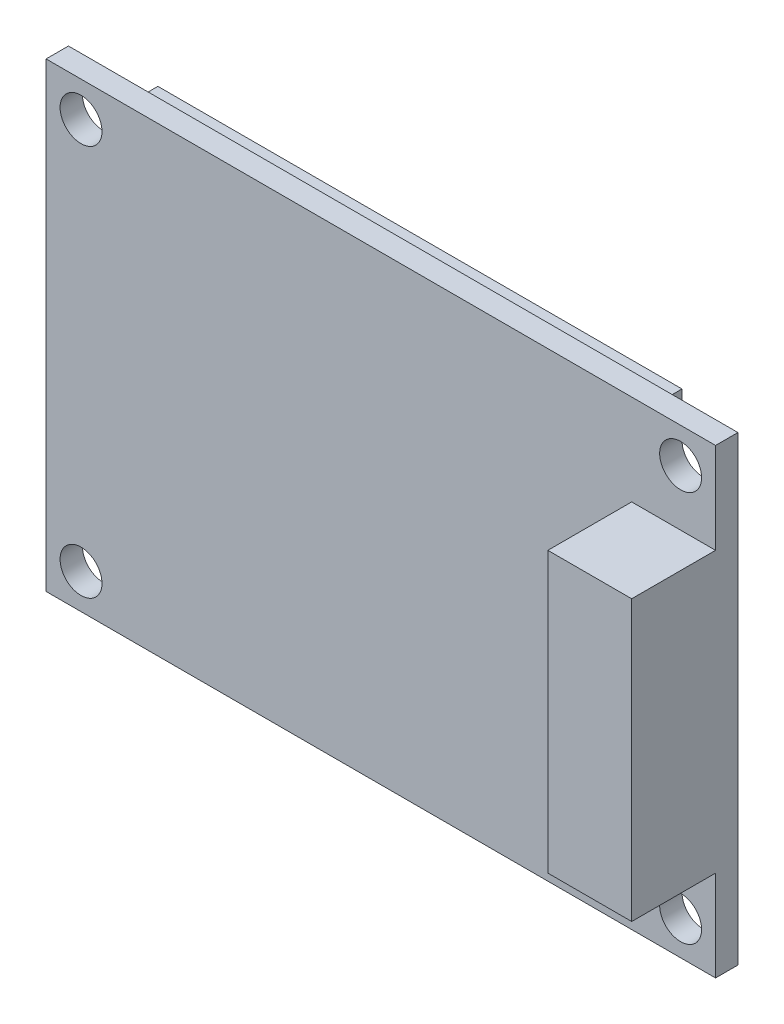
ISO-10303-21;
HEADER;
FILE_DESCRIPTION(('STEP AP214'),'2;1');
FILE_NAME('part.step','',(''),(''),'','','');
FILE_SCHEMA(('AUTOMOTIVE_DESIGN { 1 0 10303 214 1 1 1 1 }'));
ENDSEC;
DATA;
#1=APPLICATION_CONTEXT('core data for automotive mechanical design processes');
#2=APPLICATION_PROTOCOL_DEFINITION('international standard','automotive_design',2000,#1);
#3=PRODUCT_CONTEXT('',#1,'mechanical');
#4=PRODUCT('Part','Part','',(#3));
#5=PRODUCT_RELATED_PRODUCT_CATEGORY('part','',(#4));
#6=PRODUCT_DEFINITION_FORMATION('','',#4);
#7=PRODUCT_DEFINITION_CONTEXT('part definition',#1,'design');
#8=PRODUCT_DEFINITION('design','',#6,#7);
#9=PRODUCT_DEFINITION_SHAPE('','',#8);
#10=(LENGTH_UNIT() NAMED_UNIT(*) SI_UNIT(.MILLI.,.METRE.));
#11=(NAMED_UNIT(*) PLANE_ANGLE_UNIT() SI_UNIT($,.RADIAN.));
#12=(NAMED_UNIT(*) SI_UNIT($,.STERADIAN.) SOLID_ANGLE_UNIT());
#13=UNCERTAINTY_MEASURE_WITH_UNIT(LENGTH_MEASURE(1.E-05),#10,'distance_accuracy_value','');
#14=(GEOMETRIC_REPRESENTATION_CONTEXT(3) GLOBAL_UNCERTAINTY_ASSIGNED_CONTEXT((#13)) GLOBAL_UNIT_ASSIGNED_CONTEXT((#10,
#11,#12)) REPRESENTATION_CONTEXT('',''));
#15=CARTESIAN_POINT('',(0.,0.,0.));
#16=DIRECTION('',(0.,0.,1.));
#17=DIRECTION('',(1.,0.,0.));
#18=AXIS2_PLACEMENT_3D('',#15,#16,#17);
#19=CARTESIAN_POINT('',(0.,0.,1.6));
#20=DIRECTION('',(0.,0.,-1.));
#21=DIRECTION('',(-1.,0.,0.));
#22=AXIS2_PLACEMENT_3D('',#19,#20,#21);
#23=PLANE('',#22);
#24=CARTESIAN_POINT('',(21.45,14.,1.6));
#25=DIRECTION('',(0.,0.,1.));
#26=DIRECTION('',(-1.,0.,0.));
#27=AXIS2_PLACEMENT_3D('',#24,#25,#26);
#28=CIRCLE('',#27,1.5);
#29=CARTESIAN_POINT('',(19.95,14.,1.6));
#30=VERTEX_POINT('',#29);
#31=EDGE_CURVE('E236',#30,#30,#28,.T.);
#32=ORIENTED_EDGE('',*,*,#31,.F.);
#33=EDGE_LOOP('',(#32));
#34=FACE_BOUND('',#33,.T.);
#35=CARTESIAN_POINT('',(21.45,-14.,1.6));
#36=DIRECTION('',(0.,0.,1.));
#37=DIRECTION('',(-1.,0.,0.));
#38=AXIS2_PLACEMENT_3D('',#35,#36,#37);
#39=CIRCLE('',#38,1.5);
#40=CARTESIAN_POINT('',(19.95,-14.,1.6));
#41=VERTEX_POINT('',#40);
#42=EDGE_CURVE('E242',#41,#41,#39,.T.);
#43=ORIENTED_EDGE('',*,*,#42,.F.);
#44=EDGE_LOOP('',(#43));
#45=FACE_BOUND('',#44,.T.);
#46=CARTESIAN_POINT('',(-21.45,-14.,1.6));
#47=DIRECTION('',(0.,0.,1.));
#48=DIRECTION('',(1.,0.,0.));
#49=AXIS2_PLACEMENT_3D('',#46,#47,#48);
#50=CIRCLE('',#49,1.5);
#51=CARTESIAN_POINT('',(-19.95,-14.,1.6));
#52=VERTEX_POINT('',#51);
#53=EDGE_CURVE('E248',#52,#52,#50,.T.);
#54=ORIENTED_EDGE('',*,*,#53,.F.);
#55=EDGE_LOOP('',(#54));
#56=FACE_BOUND('',#55,.T.);
#57=CARTESIAN_POINT('',(-21.45,14.,1.6));
#58=DIRECTION('',(0.,0.,1.));
#59=DIRECTION('',(1.,0.,0.));
#60=AXIS2_PLACEMENT_3D('',#57,#58,#59);
#61=CIRCLE('',#60,1.5);
#62=CARTESIAN_POINT('',(-19.95,14.,1.6));
#63=VERTEX_POINT('',#62);
#64=EDGE_CURVE('E254',#63,#63,#61,.T.);
#65=ORIENTED_EDGE('',*,*,#64,.F.);
#66=EDGE_LOOP('',(#65));
#67=FACE_BOUND('',#66,.T.);
#68=DIRECTION('',(-1.,0.,0.));
#69=VECTOR('',#68,1.);
#70=CARTESIAN_POINT('',(17.95,9.99999999999999,1.6));
#71=LINE('',#70,#69);
#72=CARTESIAN_POINT('',(23.95,9.99999999999999,1.6));
#73=VERTEX_POINT('',#72);
#74=CARTESIAN_POINT('',(17.95,9.99999999999999,1.6));
#75=VERTEX_POINT('',#74);
#76=EDGE_CURVE('E163',#73,#75,#71,.T.);
#77=ORIENTED_EDGE('',*,*,#76,.F.);
#78=DIRECTION('',(0.,1.,0.));
#79=VECTOR('',#78,1.);
#80=CARTESIAN_POINT('',(23.95,16.5,1.6));
#81=LINE('',#80,#79);
#82=CARTESIAN_POINT('',(23.95,16.5,1.6));
#83=VERTEX_POINT('',#82);
#84=EDGE_CURVE('E266',#73,#83,#81,.T.);
#85=ORIENTED_EDGE('',*,*,#84,.T.);
#86=DIRECTION('',(-1.,0.,0.));
#87=VECTOR('',#86,1.);
#88=CARTESIAN_POINT('',(23.95,16.5,1.6));
#89=LINE('',#88,#87);
#90=CARTESIAN_POINT('',(-23.95,16.5,1.6));
#91=VERTEX_POINT('',#90);
#92=EDGE_CURVE('E269',#83,#91,#89,.T.);
#93=ORIENTED_EDGE('',*,*,#92,.T.);
#94=DIRECTION('',(0.,-1.,0.));
#95=VECTOR('',#94,1.);
#96=CARTESIAN_POINT('',(-23.95,16.5,1.6));
#97=LINE('',#96,#95);
#98=CARTESIAN_POINT('',(-23.95,-16.5,1.6));
#99=VERTEX_POINT('',#98);
#100=EDGE_CURVE('E260',#91,#99,#97,.T.);
#101=ORIENTED_EDGE('',*,*,#100,.T.);
#102=DIRECTION('',(1.,0.,0.));
#103=VECTOR('',#102,1.);
#104=CARTESIAN_POINT('',(23.95,-16.5,1.6));
#105=LINE('',#104,#103);
#106=CARTESIAN_POINT('',(23.95,-16.5,1.6));
#107=VERTEX_POINT('',#106);
#108=EDGE_CURVE('E263',#99,#107,#105,.T.);
#109=ORIENTED_EDGE('',*,*,#108,.T.);
#110=CARTESIAN_POINT('',(23.95,-9.99999999999999,1.6));
#111=VERTEX_POINT('',#110);
#112=EDGE_CURVE('E267',#107,#111,#81,.T.);
#113=ORIENTED_EDGE('',*,*,#112,.T.);
#114=DIRECTION('',(1.,0.,0.));
#115=VECTOR('',#114,1.);
#116=CARTESIAN_POINT('',(17.95,-9.99999999999999,1.6));
#117=LINE('',#116,#115);
#118=CARTESIAN_POINT('',(17.95,-9.99999999999999,1.6));
#119=VERTEX_POINT('',#118);
#120=EDGE_CURVE('E53',#119,#111,#117,.T.);
#121=ORIENTED_EDGE('',*,*,#120,.F.);
#122=DIRECTION('',(0.,-1.,0.));
#123=VECTOR('',#122,1.);
#124=CARTESIAN_POINT('',(17.95,9.99999999999999,1.6));
#125=LINE('',#124,#123);
#126=EDGE_CURVE('E48',#75,#119,#125,.T.);
#127=ORIENTED_EDGE('',*,*,#126,.F.);
#128=EDGE_LOOP('',(#77,#85,#93,#101,#109,#113,#121,#127));
#129=FACE_BOUND('',#128,.T.);
#130=ADVANCED_FACE('F33',(#34,#45,#56,#67,#129),#23,.F.);
#131=CARTESIAN_POINT('',(0.,0.,0.));
#132=DIRECTION('',(0.,0.,-1.));
#133=DIRECTION('',(-1.,0.,0.));
#134=AXIS2_PLACEMENT_3D('',#131,#132,#133);
#135=PLANE('',#134);
#136=DIRECTION('',(0.,-1.,0.));
#137=VECTOR('',#136,1.);
#138=CARTESIAN_POINT('',(-18.75,16.,0.));
#139=LINE('',#138,#137);
#140=CARTESIAN_POINT('',(-18.75,16.,0.));
#141=VERTEX_POINT('',#140);
#142=CARTESIAN_POINT('',(-18.75,-16.,0.));
#143=VERTEX_POINT('',#142);
#144=EDGE_CURVE('E197',#141,#143,#139,.T.);
#145=ORIENTED_EDGE('',*,*,#144,.T.);
#146=DIRECTION('',(1.,0.,0.));
#147=VECTOR('',#146,1.);
#148=CARTESIAN_POINT('',(18.75,-16.,0.));
#149=LINE('',#148,#147);
#150=CARTESIAN_POINT('',(18.75,-16.,0.));
#151=VERTEX_POINT('',#150);
#152=EDGE_CURVE('E219',#143,#151,#149,.T.);
#153=ORIENTED_EDGE('',*,*,#152,.T.);
#154=DIRECTION('',(0.,1.,0.));
#155=VECTOR('',#154,1.);
#156=CARTESIAN_POINT('',(18.75,16.,0.));
#157=LINE('',#156,#155);
#158=CARTESIAN_POINT('',(18.75,16.,0.));
#159=VERTEX_POINT('',#158);
#160=EDGE_CURVE('E221',#151,#159,#157,.T.);
#161=ORIENTED_EDGE('',*,*,#160,.T.);
#162=DIRECTION('',(-1.,0.,0.));
#163=VECTOR('',#162,1.);
#164=CARTESIAN_POINT('',(18.75,16.,0.));
#165=LINE('',#164,#163);
#166=EDGE_CURVE('E208',#159,#141,#165,.T.);
#167=ORIENTED_EDGE('',*,*,#166,.T.);
#168=EDGE_LOOP('',(#145,#153,#161,#167));
#169=FACE_BOUND('',#168,.T.);
#170=CARTESIAN_POINT('',(21.45,-14.,0.));
#171=DIRECTION('',(0.,0.,1.));
#172=DIRECTION('',(-1.,0.,0.));
#173=AXIS2_PLACEMENT_3D('',#170,#171,#172);
#174=CIRCLE('',#173,1.5);
#175=CARTESIAN_POINT('',(19.95,-14.,0.));
#176=VERTEX_POINT('',#175);
#177=EDGE_CURVE('E239',#176,#176,#174,.T.);
#178=ORIENTED_EDGE('',*,*,#177,.T.);
#179=EDGE_LOOP('',(#178));
#180=FACE_BOUND('',#179,.T.);
#181=CARTESIAN_POINT('',(-21.45,14.,0.));
#182=DIRECTION('',(0.,0.,1.));
#183=DIRECTION('',(1.,0.,0.));
#184=AXIS2_PLACEMENT_3D('',#181,#182,#183);
#185=CIRCLE('',#184,1.5);
#186=CARTESIAN_POINT('',(-19.95,14.,0.));
#187=VERTEX_POINT('',#186);
#188=EDGE_CURVE('E251',#187,#187,#185,.T.);
#189=ORIENTED_EDGE('',*,*,#188,.T.);
#190=EDGE_LOOP('',(#189));
#191=FACE_BOUND('',#190,.T.);
#192=DIRECTION('',(0.,-1.,0.));
#193=VECTOR('',#192,1.);
#194=CARTESIAN_POINT('',(-23.95,16.5,0.));
#195=LINE('',#194,#193);
#196=CARTESIAN_POINT('',(-23.95,16.5,0.));
#197=VERTEX_POINT('',#196);
#198=CARTESIAN_POINT('',(-23.95,-16.5,0.));
#199=VERTEX_POINT('',#198);
#200=EDGE_CURVE('E257',#197,#199,#195,.T.);
#201=ORIENTED_EDGE('',*,*,#200,.F.);
#202=DIRECTION('',(-1.,0.,0.));
#203=VECTOR('',#202,1.);
#204=CARTESIAN_POINT('',(23.95,16.5,0.));
#205=LINE('',#204,#203);
#206=CARTESIAN_POINT('',(23.95,16.5,0.));
#207=VERTEX_POINT('',#206);
#208=EDGE_CURVE('E264',#207,#197,#205,.T.);
#209=ORIENTED_EDGE('',*,*,#208,.F.);
#210=DIRECTION('',(0.,1.,0.));
#211=VECTOR('',#210,1.);
#212=CARTESIAN_POINT('',(23.95,16.5,0.));
#213=LINE('',#212,#211);
#214=CARTESIAN_POINT('',(23.95,-16.5,0.));
#215=VERTEX_POINT('',#214);
#216=EDGE_CURVE('E276',#215,#207,#213,.T.);
#217=ORIENTED_EDGE('',*,*,#216,.F.);
#218=DIRECTION('',(1.,0.,0.));
#219=VECTOR('',#218,1.);
#220=CARTESIAN_POINT('',(23.95,-16.5,0.));
#221=LINE('',#220,#219);
#222=EDGE_CURVE('E274',#199,#215,#221,.T.);
#223=ORIENTED_EDGE('',*,*,#222,.F.);
#224=EDGE_LOOP('',(#201,#209,#217,#223));
#225=FACE_BOUND('',#224,.T.);
#226=CARTESIAN_POINT('',(-21.45,-14.,0.));
#227=DIRECTION('',(0.,0.,1.));
#228=DIRECTION('',(1.,0.,0.));
#229=AXIS2_PLACEMENT_3D('',#226,#227,#228);
#230=CIRCLE('',#229,1.5);
#231=CARTESIAN_POINT('',(-19.95,-14.,0.));
#232=VERTEX_POINT('',#231);
#233=EDGE_CURVE('E245',#232,#232,#230,.T.);
#234=ORIENTED_EDGE('',*,*,#233,.T.);
#235=EDGE_LOOP('',(#234));
#236=FACE_BOUND('',#235,.T.);
#237=CARTESIAN_POINT('',(21.45,14.,0.));
#238=DIRECTION('',(0.,0.,1.));
#239=DIRECTION('',(-1.,0.,0.));
#240=AXIS2_PLACEMENT_3D('',#237,#238,#239);
#241=CIRCLE('',#240,1.5);
#242=CARTESIAN_POINT('',(19.95,14.,0.));
#243=VERTEX_POINT('',#242);
#244=EDGE_CURVE('E227',#243,#243,#241,.T.);
#245=ORIENTED_EDGE('',*,*,#244,.T.);
#246=EDGE_LOOP('',(#245));
#247=FACE_BOUND('',#246,.T.);
#248=ADVANCED_FACE('F294',(#169,#180,#191,#225,#236,#247),#135,.T.);
#249=CARTESIAN_POINT('',(-23.95,16.5,1.6));
#250=DIRECTION('',(1.,0.,0.));
#251=DIRECTION('',(0.,0.,-1.));
#252=AXIS2_PLACEMENT_3D('',#249,#250,#251);
#253=PLANE('',#252);
#254=ORIENTED_EDGE('',*,*,#200,.T.);
#255=DIRECTION('',(0.,0.,-1.));
#256=VECTOR('',#255,1.);
#257=CARTESIAN_POINT('',(-23.95,-16.5,1.6));
#258=LINE('',#257,#256);
#259=EDGE_CURVE('E11',#99,#199,#258,.T.);
#260=ORIENTED_EDGE('',*,*,#259,.F.);
#261=ORIENTED_EDGE('',*,*,#100,.F.);
#262=DIRECTION('',(0.,0.,-1.));
#263=VECTOR('',#262,1.);
#264=CARTESIAN_POINT('',(-23.95,16.5,1.6));
#265=LINE('',#264,#263);
#266=EDGE_CURVE('E271',#91,#197,#265,.T.);
#267=ORIENTED_EDGE('',*,*,#266,.T.);
#268=EDGE_LOOP('',(#254,#260,#261,#267));
#269=FACE_BOUND('',#268,.T.);
#270=ADVANCED_FACE('F35',(#269),#253,.F.);
#271=CARTESIAN_POINT('',(23.95,-16.5,1.6));
#272=DIRECTION('',(0.,1.,0.));
#273=DIRECTION('',(-1.,0.,0.));
#274=AXIS2_PLACEMENT_3D('',#271,#272,#273);
#275=PLANE('',#274);
#276=ORIENTED_EDGE('',*,*,#222,.T.);
#277=DIRECTION('',(0.,0.,-1.));
#278=VECTOR('',#277,1.);
#279=CARTESIAN_POINT('',(23.95,-16.5,1.6));
#280=LINE('',#279,#278);
#281=EDGE_CURVE('E41',#107,#215,#280,.T.);
#282=ORIENTED_EDGE('',*,*,#281,.F.);
#283=ORIENTED_EDGE('',*,*,#108,.F.);
#284=ORIENTED_EDGE('',*,*,#259,.T.);
#285=EDGE_LOOP('',(#276,#282,#283,#284));
#286=FACE_BOUND('',#285,.T.);
#287=ADVANCED_FACE('F340',(#286),#275,.F.);
#288=CARTESIAN_POINT('',(23.95,16.5,1.6));
#289=DIRECTION('',(-1.,0.,0.));
#290=DIRECTION('',(0.,0.,1.));
#291=AXIS2_PLACEMENT_3D('',#288,#289,#290);
#292=PLANE('',#291);
#293=ORIENTED_EDGE('',*,*,#216,.T.);
#294=DIRECTION('',(0.,0.,-1.));
#295=VECTOR('',#294,1.);
#296=CARTESIAN_POINT('',(23.95,16.5,1.6));
#297=LINE('',#296,#295);
#298=EDGE_CURVE('E281',#83,#207,#297,.T.);
#299=ORIENTED_EDGE('',*,*,#298,.F.);
#300=ORIENTED_EDGE('',*,*,#84,.F.);
#301=DIRECTION('',(0.,0.,-1.));
#302=VECTOR('',#301,1.);
#303=CARTESIAN_POINT('',(23.95,9.99999999999999,7.6));
#304=LINE('',#303,#302);
#305=CARTESIAN_POINT('',(23.95,9.99999999999999,7.6));
#306=VERTEX_POINT('',#305);
#307=EDGE_CURVE('E170',#306,#73,#304,.T.);
#308=ORIENTED_EDGE('',*,*,#307,.F.);
#309=DIRECTION('',(0.,1.,0.));
#310=VECTOR('',#309,1.);
#311=CARTESIAN_POINT('',(23.95,9.99999999999999,7.6));
#312=LINE('',#311,#310);
#313=CARTESIAN_POINT('',(23.95,-9.99999999999999,7.6));
#314=VERTEX_POINT('',#313);
#315=EDGE_CURVE('E153',#314,#306,#312,.T.);
#316=ORIENTED_EDGE('',*,*,#315,.F.);
#317=DIRECTION('',(0.,0.,-1.));
#318=VECTOR('',#317,1.);
#319=CARTESIAN_POINT('',(23.95,-9.99999999999999,7.6));
#320=LINE('',#319,#318);
#321=EDGE_CURVE('E150',#314,#111,#320,.T.);
#322=ORIENTED_EDGE('',*,*,#321,.T.);
#323=ORIENTED_EDGE('',*,*,#112,.F.);
#324=ORIENTED_EDGE('',*,*,#281,.T.);
#325=EDGE_LOOP('',(#293,#299,#300,#308,#316,#322,#323,#324));
#326=FACE_BOUND('',#325,.T.);
#327=ADVANCED_FACE('F288',(#326),#292,.F.);
#328=CARTESIAN_POINT('',(23.95,16.5,1.6));
#329=DIRECTION('',(0.,-1.,0.));
#330=DIRECTION('',(1.,0.,0.));
#331=AXIS2_PLACEMENT_3D('',#328,#329,#330);
#332=PLANE('',#331);
#333=ORIENTED_EDGE('',*,*,#208,.T.);
#334=ORIENTED_EDGE('',*,*,#266,.F.);
#335=ORIENTED_EDGE('',*,*,#92,.F.);
#336=ORIENTED_EDGE('',*,*,#298,.T.);
#337=EDGE_LOOP('',(#333,#334,#335,#336));
#338=FACE_BOUND('',#337,.T.);
#339=ADVANCED_FACE('F298',(#338),#332,.F.);
#340=CARTESIAN_POINT('',(-21.45,14.,1.6));
#341=DIRECTION('',(0.,0.,-1.));
#342=DIRECTION('',(-1.,0.,0.));
#343=AXIS2_PLACEMENT_3D('',#340,#341,#342);
#344=CYLINDRICAL_SURFACE('',#343,1.5);
#345=ORIENTED_EDGE('',*,*,#64,.T.);
#346=EDGE_LOOP('',(#345));
#347=FACE_BOUND('',#346,.T.);
#348=ORIENTED_EDGE('',*,*,#188,.F.);
#349=EDGE_LOOP('',(#348));
#350=FACE_BOUND('',#349,.T.);
#351=ADVANCED_FACE('F334',(#347,#350),#344,.F.);
#352=CARTESIAN_POINT('',(-21.45,-14.,1.6));
#353=DIRECTION('',(0.,0.,-1.));
#354=DIRECTION('',(-1.,0.,0.));
#355=AXIS2_PLACEMENT_3D('',#352,#353,#354);
#356=CYLINDRICAL_SURFACE('',#355,1.5);
#357=ORIENTED_EDGE('',*,*,#53,.T.);
#358=EDGE_LOOP('',(#357));
#359=FACE_BOUND('',#358,.T.);
#360=ORIENTED_EDGE('',*,*,#233,.F.);
#361=EDGE_LOOP('',(#360));
#362=FACE_BOUND('',#361,.T.);
#363=ADVANCED_FACE('F501',(#359,#362),#356,.F.);
#364=CARTESIAN_POINT('',(21.45,-14.,1.6));
#365=DIRECTION('',(0.,0.,-1.));
#366=DIRECTION('',(-1.,0.,0.));
#367=AXIS2_PLACEMENT_3D('',#364,#365,#366);
#368=CYLINDRICAL_SURFACE('',#367,1.5);
#369=ORIENTED_EDGE('',*,*,#42,.T.);
#370=EDGE_LOOP('',(#369));
#371=FACE_BOUND('',#370,.T.);
#372=ORIENTED_EDGE('',*,*,#177,.F.);
#373=EDGE_LOOP('',(#372));
#374=FACE_BOUND('',#373,.T.);
#375=ADVANCED_FACE('F498',(#371,#374),#368,.F.);
#376=CARTESIAN_POINT('',(21.45,14.,1.6));
#377=DIRECTION('',(0.,0.,-1.));
#378=DIRECTION('',(-1.,0.,0.));
#379=AXIS2_PLACEMENT_3D('',#376,#377,#378);
#380=CYLINDRICAL_SURFACE('',#379,1.5);
#381=ORIENTED_EDGE('',*,*,#31,.T.);
#382=EDGE_LOOP('',(#381));
#383=FACE_BOUND('',#382,.T.);
#384=ORIENTED_EDGE('',*,*,#244,.F.);
#385=EDGE_LOOP('',(#384));
#386=FACE_BOUND('',#385,.T.);
#387=ADVANCED_FACE('F357',(#383,#386),#380,.F.);
#388=CARTESIAN_POINT('',(-18.75,16.,-1.2));
#389=DIRECTION('',(-1.,0.,0.));
#390=DIRECTION('',(0.,-1.,0.));
#391=AXIS2_PLACEMENT_3D('',#388,#389,#390);
#392=PLANE('',#391);
#393=ORIENTED_EDGE('',*,*,#144,.F.);
#394=DIRECTION('',(0.,0.,1.));
#395=VECTOR('',#394,1.);
#396=CARTESIAN_POINT('',(-18.75,16.,-1.2));
#397=LINE('',#396,#395);
#398=CARTESIAN_POINT('',(-18.75,16.,-1.2));
#399=VERTEX_POINT('',#398);
#400=EDGE_CURVE('E224',#399,#141,#397,.T.);
#401=ORIENTED_EDGE('',*,*,#400,.F.);
#402=DIRECTION('',(0.,-1.,0.));
#403=VECTOR('',#402,1.);
#404=CARTESIAN_POINT('',(-18.75,16.,-1.2));
#405=LINE('',#404,#403);
#406=CARTESIAN_POINT('',(-18.75,-16.,-1.2));
#407=VERTEX_POINT('',#406);
#408=EDGE_CURVE('E204',#399,#407,#405,.T.);
#409=ORIENTED_EDGE('',*,*,#408,.T.);
#410=DIRECTION('',(0.,0.,1.));
#411=VECTOR('',#410,1.);
#412=CARTESIAN_POINT('',(-18.75,-16.,-1.2));
#413=LINE('',#412,#411);
#414=EDGE_CURVE('E217',#407,#143,#413,.T.);
#415=ORIENTED_EDGE('',*,*,#414,.T.);
#416=EDGE_LOOP('',(#393,#401,#409,#415));
#417=FACE_BOUND('',#416,.T.);
#418=ADVANCED_FACE('F362',(#417),#392,.T.);
#419=CARTESIAN_POINT('',(18.75,16.,-1.2));
#420=DIRECTION('',(0.,1.,0.));
#421=DIRECTION('',(-1.,0.,0.));
#422=AXIS2_PLACEMENT_3D('',#419,#420,#421);
#423=PLANE('',#422);
#424=ORIENTED_EDGE('',*,*,#166,.F.);
#425=DIRECTION('',(0.,0.,1.));
#426=VECTOR('',#425,1.);
#427=CARTESIAN_POINT('',(18.75,16.,-1.2));
#428=LINE('',#427,#426);
#429=CARTESIAN_POINT('',(18.75,16.,-1.2));
#430=VERTEX_POINT('',#429);
#431=EDGE_CURVE('E228',#430,#159,#428,.T.);
#432=ORIENTED_EDGE('',*,*,#431,.F.);
#433=DIRECTION('',(-1.,0.,0.));
#434=VECTOR('',#433,1.);
#435=CARTESIAN_POINT('',(18.75,16.,-1.2));
#436=LINE('',#435,#434);
#437=EDGE_CURVE('E214',#430,#399,#436,.T.);
#438=ORIENTED_EDGE('',*,*,#437,.T.);
#439=ORIENTED_EDGE('',*,*,#400,.T.);
#440=EDGE_LOOP('',(#424,#432,#438,#439));
#441=FACE_BOUND('',#440,.T.);
#442=ADVANCED_FACE('F367',(#441),#423,.T.);
#443=CARTESIAN_POINT('',(18.75,16.,-1.2));
#444=DIRECTION('',(1.,0.,0.));
#445=DIRECTION('',(0.,1.,0.));
#446=AXIS2_PLACEMENT_3D('',#443,#444,#445);
#447=PLANE('',#446);
#448=ORIENTED_EDGE('',*,*,#160,.F.);
#449=DIRECTION('',(0.,0.,1.));
#450=VECTOR('',#449,1.);
#451=CARTESIAN_POINT('',(18.75,-16.,-1.2));
#452=LINE('',#451,#450);
#453=CARTESIAN_POINT('',(18.75,-16.,-1.2));
#454=VERTEX_POINT('',#453);
#455=EDGE_CURVE('E231',#454,#151,#452,.T.);
#456=ORIENTED_EDGE('',*,*,#455,.F.);
#457=DIRECTION('',(0.,1.,0.));
#458=VECTOR('',#457,1.);
#459=CARTESIAN_POINT('',(18.75,16.,-1.2));
#460=LINE('',#459,#458);
#461=EDGE_CURVE('E211',#454,#430,#460,.T.);
#462=ORIENTED_EDGE('',*,*,#461,.T.);
#463=ORIENTED_EDGE('',*,*,#431,.T.);
#464=EDGE_LOOP('',(#448,#456,#462,#463));
#465=FACE_BOUND('',#464,.T.);
#466=ADVANCED_FACE('F377',(#465),#447,.T.);
#467=CARTESIAN_POINT('',(18.75,-16.,-1.2));
#468=DIRECTION('',(0.,-1.,0.));
#469=DIRECTION('',(1.,0.,0.));
#470=AXIS2_PLACEMENT_3D('',#467,#468,#469);
#471=PLANE('',#470);
#472=ORIENTED_EDGE('',*,*,#152,.F.);
#473=ORIENTED_EDGE('',*,*,#414,.F.);
#474=DIRECTION('',(1.,0.,0.));
#475=VECTOR('',#474,1.);
#476=CARTESIAN_POINT('',(18.75,-16.,-1.2));
#477=LINE('',#476,#475);
#478=EDGE_CURVE('E207',#407,#454,#477,.T.);
#479=ORIENTED_EDGE('',*,*,#478,.T.);
#480=ORIENTED_EDGE('',*,*,#455,.T.);
#481=EDGE_LOOP('',(#472,#473,#479,#480));
#482=FACE_BOUND('',#481,.T.);
#483=ADVANCED_FACE('F387',(#482),#471,.T.);
#484=CARTESIAN_POINT('',(0.,0.,-1.2));
#485=DIRECTION('',(0.,0.,-1.));
#486=DIRECTION('',(-1.,0.,0.));
#487=AXIS2_PLACEMENT_3D('',#484,#485,#486);
#488=PLANE('',#487);
#489=DIRECTION('',(0.,-1.,0.));
#490=VECTOR('',#489,1.);
#491=CARTESIAN_POINT('',(16.75,-13.8,-1.2));
#492=LINE('',#491,#490);
#493=CARTESIAN_POINT('',(16.75,13.8,-1.2));
#494=VERTEX_POINT('',#493);
#495=CARTESIAN_POINT('',(16.75,-13.8,-1.2));
#496=VERTEX_POINT('',#495);
#497=EDGE_CURVE('E166',#494,#496,#492,.T.);
#498=ORIENTED_EDGE('',*,*,#497,.F.);
#499=DIRECTION('',(1.,0.,0.));
#500=VECTOR('',#499,1.);
#501=CARTESIAN_POINT('',(16.75,13.8,-1.2));
#502=LINE('',#501,#500);
#503=CARTESIAN_POINT('',(-10.85,13.8,-1.2));
#504=VERTEX_POINT('',#503);
#505=EDGE_CURVE('E178',#504,#494,#502,.T.);
#506=ORIENTED_EDGE('',*,*,#505,.F.);
#507=DIRECTION('',(0.,1.,0.));
#508=VECTOR('',#507,1.);
#509=CARTESIAN_POINT('',(-10.85,-13.8,-1.2));
#510=LINE('',#509,#508);
#511=CARTESIAN_POINT('',(-10.85,-13.8,-1.2));
#512=VERTEX_POINT('',#511);
#513=EDGE_CURVE('E190',#512,#504,#510,.T.);
#514=ORIENTED_EDGE('',*,*,#513,.F.);
#515=DIRECTION('',(-1.,0.,0.));
#516=VECTOR('',#515,1.);
#517=CARTESIAN_POINT('',(16.75,-13.8,-1.2));
#518=LINE('',#517,#516);
#519=EDGE_CURVE('E168',#496,#512,#518,.T.);
#520=ORIENTED_EDGE('',*,*,#519,.F.);
#521=EDGE_LOOP('',(#498,#506,#514,#520));
#522=FACE_BOUND('',#521,.T.);
#523=ORIENTED_EDGE('',*,*,#408,.F.);
#524=ORIENTED_EDGE('',*,*,#437,.F.);
#525=ORIENTED_EDGE('',*,*,#461,.F.);
#526=ORIENTED_EDGE('',*,*,#478,.F.);
#527=EDGE_LOOP('',(#523,#524,#525,#526));
#528=FACE_BOUND('',#527,.T.);
#529=ADVANCED_FACE('F397',(#522,#528),#488,.T.);
#530=CARTESIAN_POINT('',(16.75,-13.8,-0.7));
#531=DIRECTION('',(1.,0.,0.));
#532=DIRECTION('',(0.,0.,-1.));
#533=AXIS2_PLACEMENT_3D('',#530,#531,#532);
#534=PLANE('',#533);
#535=ORIENTED_EDGE('',*,*,#497,.T.);
#536=DIRECTION('',(0.,0.,-1.));
#537=VECTOR('',#536,1.);
#538=CARTESIAN_POINT('',(16.75,-13.8,-0.7));
#539=LINE('',#538,#537);
#540=CARTESIAN_POINT('',(16.75,-13.8,-0.7));
#541=VERTEX_POINT('',#540);
#542=EDGE_CURVE('E186',#541,#496,#539,.T.);
#543=ORIENTED_EDGE('',*,*,#542,.F.);
#544=DIRECTION('',(0.,-1.,0.));
#545=VECTOR('',#544,1.);
#546=CARTESIAN_POINT('',(16.75,-13.8,-0.7));
#547=LINE('',#546,#545);
#548=CARTESIAN_POINT('',(16.75,13.8,-0.7));
#549=VERTEX_POINT('',#548);
#550=EDGE_CURVE('E174',#549,#541,#547,.T.);
#551=ORIENTED_EDGE('',*,*,#550,.F.);
#552=DIRECTION('',(0.,0.,-1.));
#553=VECTOR('',#552,1.);
#554=CARTESIAN_POINT('',(16.75,13.8,-0.7));
#555=LINE('',#554,#553);
#556=EDGE_CURVE('E195',#549,#494,#555,.T.);
#557=ORIENTED_EDGE('',*,*,#556,.T.);
#558=EDGE_LOOP('',(#535,#543,#551,#557));
#559=FACE_BOUND('',#558,.T.);
#560=ADVANCED_FACE('F407',(#559),#534,.F.);
#561=CARTESIAN_POINT('',(16.75,13.8,-0.7));
#562=DIRECTION('',(0.,1.,0.));
#563=DIRECTION('',(-1.,0.,0.));
#564=AXIS2_PLACEMENT_3D('',#561,#562,#563);
#565=PLANE('',#564);
#566=ORIENTED_EDGE('',*,*,#505,.T.);
#567=ORIENTED_EDGE('',*,*,#556,.F.);
#568=DIRECTION('',(1.,0.,0.));
#569=VECTOR('',#568,1.);
#570=CARTESIAN_POINT('',(16.75,13.8,-0.7));
#571=LINE('',#570,#569);
#572=CARTESIAN_POINT('',(-10.85,13.8,-0.7));
#573=VERTEX_POINT('',#572);
#574=EDGE_CURVE('E184',#573,#549,#571,.T.);
#575=ORIENTED_EDGE('',*,*,#574,.F.);
#576=DIRECTION('',(0.,0.,-1.));
#577=VECTOR('',#576,1.);
#578=CARTESIAN_POINT('',(-10.85,13.8,-0.7));
#579=LINE('',#578,#577);
#580=EDGE_CURVE('E198',#573,#504,#579,.T.);
#581=ORIENTED_EDGE('',*,*,#580,.T.);
#582=EDGE_LOOP('',(#566,#567,#575,#581));
#583=FACE_BOUND('',#582,.T.);
#584=ADVANCED_FACE('F417',(#583),#565,.F.);
#585=CARTESIAN_POINT('',(-10.85,-13.8,-0.7));
#586=DIRECTION('',(-1.,0.,0.));
#587=DIRECTION('',(0.,0.,1.));
#588=AXIS2_PLACEMENT_3D('',#585,#586,#587);
#589=PLANE('',#588);
#590=ORIENTED_EDGE('',*,*,#513,.T.);
#591=ORIENTED_EDGE('',*,*,#580,.F.);
#592=DIRECTION('',(0.,1.,0.));
#593=VECTOR('',#592,1.);
#594=CARTESIAN_POINT('',(-10.85,-13.8,-0.7));
#595=LINE('',#594,#593);
#596=CARTESIAN_POINT('',(-10.85,-13.8,-0.7));
#597=VERTEX_POINT('',#596);
#598=EDGE_CURVE('E181',#597,#573,#595,.T.);
#599=ORIENTED_EDGE('',*,*,#598,.F.);
#600=DIRECTION('',(0.,0.,-1.));
#601=VECTOR('',#600,1.);
#602=CARTESIAN_POINT('',(-10.85,-13.8,-0.7));
#603=LINE('',#602,#601);
#604=EDGE_CURVE('E200',#597,#512,#603,.T.);
#605=ORIENTED_EDGE('',*,*,#604,.T.);
#606=EDGE_LOOP('',(#590,#591,#599,#605));
#607=FACE_BOUND('',#606,.T.);
#608=ADVANCED_FACE('F427',(#607),#589,.F.);
#609=CARTESIAN_POINT('',(16.75,-13.8,-0.7));
#610=DIRECTION('',(0.,-1.,0.));
#611=DIRECTION('',(1.,0.,0.));
#612=AXIS2_PLACEMENT_3D('',#609,#610,#611);
#613=PLANE('',#612);
#614=ORIENTED_EDGE('',*,*,#519,.T.);
#615=ORIENTED_EDGE('',*,*,#604,.F.);
#616=DIRECTION('',(-1.,0.,0.));
#617=VECTOR('',#616,1.);
#618=CARTESIAN_POINT('',(16.75,-13.8,-0.7));
#619=LINE('',#618,#617);
#620=EDGE_CURVE('E177',#541,#597,#619,.T.);
#621=ORIENTED_EDGE('',*,*,#620,.F.);
#622=ORIENTED_EDGE('',*,*,#542,.T.);
#623=EDGE_LOOP('',(#614,#615,#621,#622));
#624=FACE_BOUND('',#623,.T.);
#625=ADVANCED_FACE('F437',(#624),#613,.F.);
#626=CARTESIAN_POINT('',(0.,0.,-0.7));
#627=DIRECTION('',(0.,0.,1.));
#628=DIRECTION('',(1.,0.,0.));
#629=AXIS2_PLACEMENT_3D('',#626,#627,#628);
#630=PLANE('',#629);
#631=ORIENTED_EDGE('',*,*,#550,.T.);
#632=ORIENTED_EDGE('',*,*,#620,.T.);
#633=ORIENTED_EDGE('',*,*,#598,.T.);
#634=ORIENTED_EDGE('',*,*,#574,.T.);
#635=EDGE_LOOP('',(#631,#632,#633,#634));
#636=FACE_BOUND('',#635,.T.);
#637=ADVANCED_FACE('F447',(#636),#630,.F.);
#638=CARTESIAN_POINT('',(17.95,9.99999999999999,7.6));
#639=DIRECTION('',(1.,0.,0.));
#640=DIRECTION('',(0.,1.,0.));
#641=AXIS2_PLACEMENT_3D('',#638,#639,#640);
#642=PLANE('',#641);
#643=ORIENTED_EDGE('',*,*,#126,.T.);
#644=DIRECTION('',(0.,0.,-1.));
#645=VECTOR('',#644,1.);
#646=CARTESIAN_POINT('',(17.95,-9.99999999999999,7.6));
#647=LINE('',#646,#645);
#648=CARTESIAN_POINT('',(17.95,-9.99999999999999,7.6));
#649=VERTEX_POINT('',#648);
#650=EDGE_CURVE('E148',#649,#119,#647,.T.);
#651=ORIENTED_EDGE('',*,*,#650,.F.);
#652=DIRECTION('',(0.,-1.,0.));
#653=VECTOR('',#652,1.);
#654=CARTESIAN_POINT('',(17.95,9.99999999999999,7.6));
#655=LINE('',#654,#653);
#656=CARTESIAN_POINT('',(17.95,9.99999999999999,7.6));
#657=VERTEX_POINT('',#656);
#658=EDGE_CURVE('E154',#657,#649,#655,.T.);
#659=ORIENTED_EDGE('',*,*,#658,.F.);
#660=DIRECTION('',(0.,0.,-1.));
#661=VECTOR('',#660,1.);
#662=CARTESIAN_POINT('',(17.95,9.99999999999999,7.6));
#663=LINE('',#662,#661);
#664=EDGE_CURVE('E308',#657,#75,#663,.T.);
#665=ORIENTED_EDGE('',*,*,#664,.T.);
#666=EDGE_LOOP('',(#643,#651,#659,#665));
#667=FACE_BOUND('',#666,.T.);
#668=ADVANCED_FACE('F165',(#667),#642,.F.);
#669=CARTESIAN_POINT('',(17.95,-9.99999999999999,7.6));
#670=DIRECTION('',(0.,1.,0.));
#671=DIRECTION('',(0.,0.,1.));
#672=AXIS2_PLACEMENT_3D('',#669,#670,#671);
#673=PLANE('',#672);
#674=ORIENTED_EDGE('',*,*,#120,.T.);
#675=ORIENTED_EDGE('',*,*,#321,.F.);
#676=DIRECTION('',(1.,0.,0.));
#677=VECTOR('',#676,1.);
#678=CARTESIAN_POINT('',(17.95,-9.99999999999999,7.6));
#679=LINE('',#678,#677);
#680=EDGE_CURVE('E144',#649,#314,#679,.T.);
#681=ORIENTED_EDGE('',*,*,#680,.F.);
#682=ORIENTED_EDGE('',*,*,#650,.T.);
#683=EDGE_LOOP('',(#674,#675,#681,#682));
#684=FACE_BOUND('',#683,.T.);
#685=ADVANCED_FACE('F146',(#684),#673,.F.);
#686=CARTESIAN_POINT('',(17.95,9.99999999999999,7.6));
#687=DIRECTION('',(0.,-1.,0.));
#688=DIRECTION('',(0.,0.,-1.));
#689=AXIS2_PLACEMENT_3D('',#686,#687,#688);
#690=PLANE('',#689);
#691=ORIENTED_EDGE('',*,*,#76,.T.);
#692=ORIENTED_EDGE('',*,*,#664,.F.);
#693=DIRECTION('',(-1.,0.,0.));
#694=VECTOR('',#693,1.);
#695=CARTESIAN_POINT('',(17.95,9.99999999999999,7.6));
#696=LINE('',#695,#694);
#697=EDGE_CURVE('E159',#306,#657,#696,.T.);
#698=ORIENTED_EDGE('',*,*,#697,.F.);
#699=ORIENTED_EDGE('',*,*,#307,.T.);
#700=EDGE_LOOP('',(#691,#692,#698,#699));
#701=FACE_BOUND('',#700,.T.);
#702=ADVANCED_FACE('F307',(#701),#690,.F.);
#703=CARTESIAN_POINT('',(0.,0.,7.6));
#704=DIRECTION('',(0.,0.,1.));
#705=DIRECTION('',(1.,0.,0.));
#706=AXIS2_PLACEMENT_3D('',#703,#704,#705);
#707=PLANE('',#706);
#708=ORIENTED_EDGE('',*,*,#658,.T.);
#709=ORIENTED_EDGE('',*,*,#680,.T.);
#710=ORIENTED_EDGE('',*,*,#315,.T.);
#711=ORIENTED_EDGE('',*,*,#697,.T.);
#712=EDGE_LOOP('',(#708,#709,#710,#711));
#713=FACE_BOUND('',#712,.T.);
#714=ADVANCED_FACE('F157',(#713),#707,.T.);
#715=CLOSED_SHELL('',(#130,#248,#270,#287,#327,#339,#351,#363,#375,#387,#418,#442,#466,#483,
#529,#560,#584,#608,#625,#637,#668,#685,#702,#714));
#716=MANIFOLD_SOLID_BREP('B2',#715);
#717=ADVANCED_BREP_SHAPE_REPRESENTATION('',(#18,#716),#14);
#718=SHAPE_DEFINITION_REPRESENTATION(#9,#717);
ENDSEC;
END-ISO-10303-21;
